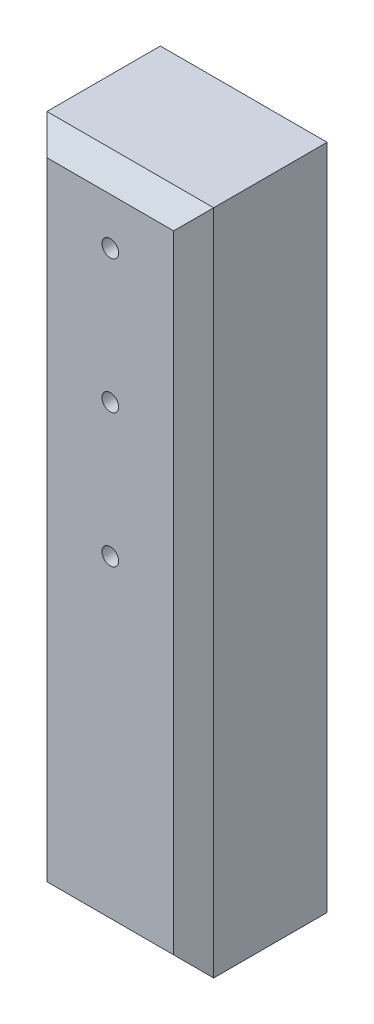
ISO-10303-21;
HEADER;
FILE_DESCRIPTION(('STEP AP214'),'2;1');
FILE_NAME('part.step','',(''),(''),'','','');
FILE_SCHEMA(('AUTOMOTIVE_DESIGN { 1 0 10303 214 1 1 1 1 }'));
ENDSEC;
DATA;
#1=APPLICATION_CONTEXT('core data for automotive mechanical design processes');
#2=APPLICATION_PROTOCOL_DEFINITION('international standard','automotive_design',2000,#1);
#3=PRODUCT_CONTEXT('',#1,'mechanical');
#4=PRODUCT('Part','Part','',(#3));
#5=PRODUCT_RELATED_PRODUCT_CATEGORY('part','',(#4));
#6=PRODUCT_DEFINITION_FORMATION('','',#4);
#7=PRODUCT_DEFINITION_CONTEXT('part definition',#1,'design');
#8=PRODUCT_DEFINITION('design','',#6,#7);
#9=PRODUCT_DEFINITION_SHAPE('','',#8);
#10=(LENGTH_UNIT() NAMED_UNIT(*) SI_UNIT(.MILLI.,.METRE.));
#11=(NAMED_UNIT(*) PLANE_ANGLE_UNIT() SI_UNIT($,.RADIAN.));
#12=(NAMED_UNIT(*) SI_UNIT($,.STERADIAN.) SOLID_ANGLE_UNIT());
#13=UNCERTAINTY_MEASURE_WITH_UNIT(LENGTH_MEASURE(1.E-05),#10,'distance_accuracy_value','');
#14=(GEOMETRIC_REPRESENTATION_CONTEXT(3) GLOBAL_UNCERTAINTY_ASSIGNED_CONTEXT((#13)) GLOBAL_UNIT_ASSIGNED_CONTEXT((#10,
#11,#12)) REPRESENTATION_CONTEXT('',''));
#15=CARTESIAN_POINT('',(0.,0.,0.));
#16=DIRECTION('',(0.,0.,1.));
#17=DIRECTION('',(1.,0.,0.));
#18=AXIS2_PLACEMENT_3D('',#15,#16,#17);
#19=CARTESIAN_POINT('',(-5.,100.,-5.00000000000002));
#20=DIRECTION('',(0.,-1.,0.));
#21=DIRECTION('',(0.,0.,-1.));
#22=AXIS2_PLACEMENT_3D('',#19,#20,#21);
#23=CYLINDRICAL_SURFACE('',#22,1.60000000000001);
#24=CARTESIAN_POINT('',(-5.,0.,-5.00000000000002));
#25=DIRECTION('',(0.,1.,0.));
#26=DIRECTION('',(0.,0.,1.));
#27=AXIS2_PLACEMENT_3D('',#24,#25,#26);
#28=CIRCLE('',#27,1.60000000000001);
#29=CARTESIAN_POINT('',(-5.,0.,-3.40000000000001));
#30=VERTEX_POINT('',#29);
#31=EDGE_CURVE('E104',#30,#30,#28,.T.);
#32=ORIENTED_EDGE('',*,*,#31,.F.);
#33=EDGE_LOOP('',(#32));
#34=FACE_BOUND('',#33,.T.);
#35=CARTESIAN_POINT('',(-5.,40.,-5.00000000000002));
#36=DIRECTION('',(0.,1.,0.));
#37=DIRECTION('',(0.,0.,1.));
#38=AXIS2_PLACEMENT_3D('',#35,#36,#37);
#39=CIRCLE('',#38,1.60000000000001);
#40=CARTESIAN_POINT('',(-5.,40.,-3.40000000000001));
#41=VERTEX_POINT('',#40);
#42=EDGE_CURVE('E168',#41,#41,#39,.T.);
#43=ORIENTED_EDGE('',*,*,#42,.T.);
#44=EDGE_LOOP('',(#43));
#45=FACE_BOUND('',#44,.T.);
#46=ADVANCED_FACE('F32',(#34,#45),#23,.F.);
#47=CARTESIAN_POINT('',(13.,100.,-5.00000000000002));
#48=DIRECTION('',(0.,-1.,0.));
#49=DIRECTION('',(0.,0.,-1.));
#50=AXIS2_PLACEMENT_3D('',#47,#48,#49);
#51=CYLINDRICAL_SURFACE('',#50,1.60000000000002);
#52=CARTESIAN_POINT('',(13.,0.,-5.00000000000002));
#53=DIRECTION('',(0.,1.,0.));
#54=DIRECTION('',(0.,0.,1.));
#55=AXIS2_PLACEMENT_3D('',#52,#53,#54);
#56=CIRCLE('',#55,1.60000000000002);
#57=CARTESIAN_POINT('',(13.,0.,-3.4));
#58=VERTEX_POINT('',#57);
#59=EDGE_CURVE('E109',#58,#58,#56,.T.);
#60=ORIENTED_EDGE('',*,*,#59,.F.);
#61=EDGE_LOOP('',(#60));
#62=FACE_BOUND('',#61,.T.);
#63=CARTESIAN_POINT('',(13.,40.,-5.00000000000002));
#64=DIRECTION('',(0.,1.,0.));
#65=DIRECTION('',(0.,0.,1.));
#66=AXIS2_PLACEMENT_3D('',#63,#64,#65);
#67=CIRCLE('',#66,1.60000000000002);
#68=CARTESIAN_POINT('',(13.,40.,-3.4));
#69=VERTEX_POINT('',#68);
#70=EDGE_CURVE('E165',#69,#69,#67,.T.);
#71=ORIENTED_EDGE('',*,*,#70,.T.);
#72=EDGE_LOOP('',(#71));
#73=FACE_BOUND('',#72,.T.);
#74=ADVANCED_FACE('F187',(#62,#73),#51,.F.);
#75=CARTESIAN_POINT('',(-5.,100.,4.99999999999999));
#76=DIRECTION('',(0.,-1.,0.));
#77=DIRECTION('',(0.,0.,-1.));
#78=AXIS2_PLACEMENT_3D('',#75,#76,#77);
#79=CYLINDRICAL_SURFACE('',#78,1.6);
#80=CARTESIAN_POINT('',(-5.,0.,4.99999999999999));
#81=DIRECTION('',(0.,1.,0.));
#82=DIRECTION('',(0.,0.,1.));
#83=AXIS2_PLACEMENT_3D('',#80,#81,#82);
#84=CIRCLE('',#83,1.6);
#85=CARTESIAN_POINT('',(-5.,0.,6.59999999999999));
#86=VERTEX_POINT('',#85);
#87=EDGE_CURVE('E179',#86,#86,#84,.T.);
#88=ORIENTED_EDGE('',*,*,#87,.F.);
#89=EDGE_LOOP('',(#88));
#90=FACE_BOUND('',#89,.T.);
#91=CARTESIAN_POINT('',(-5.,40.,4.99999999999999));
#92=DIRECTION('',(0.,1.,0.));
#93=DIRECTION('',(0.,0.,1.));
#94=AXIS2_PLACEMENT_3D('',#91,#92,#93);
#95=CIRCLE('',#94,1.6);
#96=CARTESIAN_POINT('',(-5.,40.,6.59999999999999));
#97=VERTEX_POINT('',#96);
#98=EDGE_CURVE('E162',#97,#97,#95,.T.);
#99=ORIENTED_EDGE('',*,*,#98,.T.);
#100=EDGE_LOOP('',(#99));
#101=FACE_BOUND('',#100,.T.);
#102=ADVANCED_FACE('F190',(#90,#101),#79,.F.);
#103=CARTESIAN_POINT('',(13.,100.,4.99999999999999));
#104=DIRECTION('',(0.,-1.,0.));
#105=DIRECTION('',(0.,0.,-1.));
#106=AXIS2_PLACEMENT_3D('',#103,#104,#105);
#107=CYLINDRICAL_SURFACE('',#106,1.6);
#108=CARTESIAN_POINT('',(13.,0.,4.99999999999999));
#109=DIRECTION('',(0.,1.,0.));
#110=DIRECTION('',(0.,0.,1.));
#111=AXIS2_PLACEMENT_3D('',#108,#109,#110);
#112=CIRCLE('',#111,1.6);
#113=CARTESIAN_POINT('',(13.,0.,6.59999999999999));
#114=VERTEX_POINT('',#113);
#115=EDGE_CURVE('E92',#114,#114,#112,.T.);
#116=ORIENTED_EDGE('',*,*,#115,.F.);
#117=EDGE_LOOP('',(#116));
#118=FACE_BOUND('',#117,.T.);
#119=CARTESIAN_POINT('',(13.,40.,4.99999999999999));
#120=DIRECTION('',(0.,1.,0.));
#121=DIRECTION('',(0.,0.,1.));
#122=AXIS2_PLACEMENT_3D('',#119,#120,#121);
#123=CIRCLE('',#122,1.6);
#124=CARTESIAN_POINT('',(13.,40.,6.59999999999999));
#125=VERTEX_POINT('',#124);
#126=EDGE_CURVE('E122',#125,#125,#123,.T.);
#127=ORIENTED_EDGE('',*,*,#126,.T.);
#128=EDGE_LOOP('',(#127));
#129=FACE_BOUND('',#128,.T.);
#130=ADVANCED_FACE('F221',(#118,#129),#107,.F.);
#131=CARTESIAN_POINT('',(0.,100.,0.));
#132=DIRECTION('',(0.,-1.,0.));
#133=DIRECTION('',(0.,0.,-1.));
#134=AXIS2_PLACEMENT_3D('',#131,#132,#133);
#135=PLANE('',#134);
#136=DIRECTION('',(0.,0.,1.));
#137=VECTOR('',#136,1.);
#138=CARTESIAN_POINT('',(-8.5,100.,9.99999999999998));
#139=LINE('',#138,#137);
#140=CARTESIAN_POINT('',(-8.5,100.,-10.));
#141=VERTEX_POINT('',#140);
#142=CARTESIAN_POINT('',(-8.5,100.,6.99999999999995));
#143=VERTEX_POINT('',#142);
#144=EDGE_CURVE('E87',#141,#143,#139,.T.);
#145=ORIENTED_EDGE('',*,*,#144,.T.);
#146=DIRECTION('',(1.,0.,0.));
#147=VECTOR('',#146,1.);
#148=CARTESIAN_POINT('',(0.,100.,6.99999999999996));
#149=LINE('',#148,#147);
#150=CARTESIAN_POINT('',(16.5,100.,6.99999999999999));
#151=VERTEX_POINT('',#150);
#152=EDGE_CURVE('E134',#143,#151,#149,.T.);
#153=ORIENTED_EDGE('',*,*,#152,.T.);
#154=DIRECTION('',(0.,0.,-1.));
#155=VECTOR('',#154,1.);
#156=CARTESIAN_POINT('',(16.5,100.,9.99999999999998));
#157=LINE('',#156,#155);
#158=CARTESIAN_POINT('',(16.5,100.,-10.));
#159=VERTEX_POINT('',#158);
#160=EDGE_CURVE('E173',#151,#159,#157,.T.);
#161=ORIENTED_EDGE('',*,*,#160,.T.);
#162=DIRECTION('',(-1.,0.,0.));
#163=VECTOR('',#162,1.);
#164=CARTESIAN_POINT('',(-17.25,100.,-10.));
#165=LINE('',#164,#163);
#166=EDGE_CURVE('E103',#159,#141,#165,.T.);
#167=ORIENTED_EDGE('',*,*,#166,.T.);
#168=EDGE_LOOP('',(#145,#153,#161,#167));
#169=FACE_BOUND('',#168,.T.);
#170=ADVANCED_FACE('F218',(#169),#135,.F.);
#171=CARTESIAN_POINT('',(0.,0.,0.));
#172=DIRECTION('',(0.,-1.,0.));
#173=DIRECTION('',(0.,0.,-1.));
#174=AXIS2_PLACEMENT_3D('',#171,#172,#173);
#175=PLANE('',#174);
#176=DIRECTION('',(0.,0.,-1.));
#177=VECTOR('',#176,1.);
#178=CARTESIAN_POINT('',(16.5,0.,9.99999999999998));
#179=LINE('',#178,#177);
#180=CARTESIAN_POINT('',(16.5,0.,6.99999999999999));
#181=VERTEX_POINT('',#180);
#182=CARTESIAN_POINT('',(16.5,0.,-10.));
#183=VERTEX_POINT('',#182);
#184=EDGE_CURVE('E171',#181,#183,#179,.T.);
#185=ORIENTED_EDGE('',*,*,#184,.F.);
#186=DIRECTION('',(-1.,0.,0.));
#187=VECTOR('',#186,1.);
#188=CARTESIAN_POINT('',(-8.49999999999999,0.,6.99999999999995));
#189=LINE('',#188,#187);
#190=CARTESIAN_POINT('',(-8.5,0.,6.99999999999995));
#191=VERTEX_POINT('',#190);
#192=EDGE_CURVE('E11',#181,#191,#189,.T.);
#193=ORIENTED_EDGE('',*,*,#192,.T.);
#194=DIRECTION('',(0.,0.,1.));
#195=VECTOR('',#194,1.);
#196=CARTESIAN_POINT('',(-8.5,0.,9.99999999999998));
#197=LINE('',#196,#195);
#198=CARTESIAN_POINT('',(-8.5,0.,-10.));
#199=VERTEX_POINT('',#198);
#200=EDGE_CURVE('E86',#199,#191,#197,.T.);
#201=ORIENTED_EDGE('',*,*,#200,.F.);
#202=DIRECTION('',(-1.,0.,0.));
#203=VECTOR('',#202,1.);
#204=CARTESIAN_POINT('',(17.25,0.,-10.));
#205=LINE('',#204,#203);
#206=EDGE_CURVE('E97',#183,#199,#205,.T.);
#207=ORIENTED_EDGE('',*,*,#206,.F.);
#208=EDGE_LOOP('',(#185,#193,#201,#207));
#209=FACE_BOUND('',#208,.T.);
#210=ORIENTED_EDGE('',*,*,#87,.T.);
#211=EDGE_LOOP('',(#210));
#212=FACE_BOUND('',#211,.T.);
#213=ORIENTED_EDGE('',*,*,#31,.T.);
#214=EDGE_LOOP('',(#213));
#215=FACE_BOUND('',#214,.T.);
#216=ORIENTED_EDGE('',*,*,#59,.T.);
#217=EDGE_LOOP('',(#216));
#218=FACE_BOUND('',#217,.T.);
#219=ORIENTED_EDGE('',*,*,#115,.T.);
#220=EDGE_LOOP('',(#219));
#221=FACE_BOUND('',#220,.T.);
#222=ADVANCED_FACE('F95',(#209,#212,#215,#218,#221),#175,.T.);
#223=CARTESIAN_POINT('',(17.25,100.,9.99999999999999));
#224=DIRECTION('',(0.,0.,-1.));
#225=DIRECTION('',(-1.,0.,0.));
#226=AXIS2_PLACEMENT_3D('',#223,#224,#225);
#227=PLANE('',#226);
#228=DIRECTION('',(1.,0.,0.));
#229=VECTOR('',#228,1.);
#230=CARTESIAN_POINT('',(16.5,2.99999999999999,9.99999999999999));
#231=LINE('',#230,#229);
#232=CARTESIAN_POINT('',(-5.50000000000002,2.99999999999999,9.99999999999996));
#233=VERTEX_POINT('',#232);
#234=CARTESIAN_POINT('',(13.5,2.99999999999999,9.99999999999999));
#235=VERTEX_POINT('',#234);
#236=EDGE_CURVE('E125',#233,#235,#231,.T.);
#237=ORIENTED_EDGE('',*,*,#236,.T.);
#238=DIRECTION('',(0.,1.,0.));
#239=VECTOR('',#238,1.);
#240=CARTESIAN_POINT('',(13.5,100.,9.99999999999999));
#241=LINE('',#240,#239);
#242=CARTESIAN_POINT('',(13.5,97.,9.99999999999999));
#243=VERTEX_POINT('',#242);
#244=EDGE_CURVE('E131',#235,#243,#241,.T.);
#245=ORIENTED_EDGE('',*,*,#244,.T.);
#246=DIRECTION('',(-1.,0.,0.));
#247=VECTOR('',#246,1.);
#248=CARTESIAN_POINT('',(17.25,97.,9.99999999999999));
#249=LINE('',#248,#247);
#250=CARTESIAN_POINT('',(-5.50000000000002,97.,9.99999999999996));
#251=VERTEX_POINT('',#250);
#252=EDGE_CURVE('E129',#243,#251,#249,.T.);
#253=ORIENTED_EDGE('',*,*,#252,.T.);
#254=DIRECTION('',(0.,-1.,0.));
#255=VECTOR('',#254,1.);
#256=CARTESIAN_POINT('',(-5.50000000000002,100.,9.99999999999996));
#257=LINE('',#256,#255);
#258=EDGE_CURVE('E127',#251,#233,#257,.T.);
#259=ORIENTED_EDGE('',*,*,#258,.T.);
#260=EDGE_LOOP('',(#237,#245,#253,#259));
#261=FACE_BOUND('',#260,.T.);
#262=CARTESIAN_POINT('',(4.,50.,9.99999999999997));
#263=DIRECTION('',(0.,0.,1.));
#264=DIRECTION('',(1.,0.,0.));
#265=AXIS2_PLACEMENT_3D('',#262,#263,#264);
#266=CIRCLE('',#265,1.25);
#267=CARTESIAN_POINT('',(5.25,50.,9.99999999999997));
#268=VERTEX_POINT('',#267);
#269=EDGE_CURVE('E116',#268,#268,#266,.T.);
#270=ORIENTED_EDGE('',*,*,#269,.F.);
#271=EDGE_LOOP('',(#270));
#272=FACE_BOUND('',#271,.T.);
#273=CARTESIAN_POINT('',(4.,70.,9.99999999999997));
#274=DIRECTION('',(0.,0.,1.));
#275=DIRECTION('',(1.,0.,0.));
#276=AXIS2_PLACEMENT_3D('',#273,#274,#275);
#277=CIRCLE('',#276,1.25);
#278=CARTESIAN_POINT('',(5.25,70.,9.99999999999997));
#279=VERTEX_POINT('',#278);
#280=EDGE_CURVE('E152',#279,#279,#277,.T.);
#281=ORIENTED_EDGE('',*,*,#280,.F.);
#282=EDGE_LOOP('',(#281));
#283=FACE_BOUND('',#282,.T.);
#284=CARTESIAN_POINT('',(4.,90.,9.99999999999997));
#285=DIRECTION('',(0.,0.,1.));
#286=DIRECTION('',(1.,0.,0.));
#287=AXIS2_PLACEMENT_3D('',#284,#285,#286);
#288=CIRCLE('',#287,1.25);
#289=CARTESIAN_POINT('',(5.25,90.,9.99999999999997));
#290=VERTEX_POINT('',#289);
#291=EDGE_CURVE('E146',#290,#290,#288,.T.);
#292=ORIENTED_EDGE('',*,*,#291,.F.);
#293=EDGE_LOOP('',(#292));
#294=FACE_BOUND('',#293,.T.);
#295=ADVANCED_FACE('F225',(#261,#272,#283,#294),#227,.F.);
#296=CARTESIAN_POINT('',(17.25,100.,-10.));
#297=DIRECTION('',(0.,0.,1.));
#298=DIRECTION('',(1.,0.,0.));
#299=AXIS2_PLACEMENT_3D('',#296,#297,#298);
#300=PLANE('',#299);
#301=CARTESIAN_POINT('',(4.,50.,-10.));
#302=DIRECTION('',(0.,0.,1.));
#303=DIRECTION('',(1.,0.,0.));
#304=AXIS2_PLACEMENT_3D('',#301,#302,#303);
#305=CIRCLE('',#304,1.25);
#306=CARTESIAN_POINT('',(5.25,50.,-10.));
#307=VERTEX_POINT('',#306);
#308=EDGE_CURVE('E119',#307,#307,#305,.T.);
#309=ORIENTED_EDGE('',*,*,#308,.T.);
#310=EDGE_LOOP('',(#309));
#311=FACE_BOUND('',#310,.T.);
#312=CARTESIAN_POINT('',(4.,70.,-10.));
#313=DIRECTION('',(0.,0.,1.));
#314=DIRECTION('',(1.,0.,0.));
#315=AXIS2_PLACEMENT_3D('',#312,#313,#314);
#316=CIRCLE('',#315,1.25);
#317=CARTESIAN_POINT('',(5.25,70.,-10.));
#318=VERTEX_POINT('',#317);
#319=EDGE_CURVE('E115',#318,#318,#316,.T.);
#320=ORIENTED_EDGE('',*,*,#319,.T.);
#321=EDGE_LOOP('',(#320));
#322=FACE_BOUND('',#321,.T.);
#323=CARTESIAN_POINT('',(4.,90.,-10.));
#324=DIRECTION('',(0.,0.,1.));
#325=DIRECTION('',(1.,0.,0.));
#326=AXIS2_PLACEMENT_3D('',#323,#324,#325);
#327=CIRCLE('',#326,1.25);
#328=CARTESIAN_POINT('',(5.25,90.,-10.));
#329=VERTEX_POINT('',#328);
#330=EDGE_CURVE('E112',#329,#329,#327,.T.);
#331=ORIENTED_EDGE('',*,*,#330,.T.);
#332=EDGE_LOOP('',(#331));
#333=FACE_BOUND('',#332,.T.);
#334=DIRECTION('',(0.,-1.,0.));
#335=VECTOR('',#334,1.);
#336=CARTESIAN_POINT('',(16.5,100.,-10.));
#337=LINE('',#336,#335);
#338=EDGE_CURVE('E98',#159,#183,#337,.T.);
#339=ORIENTED_EDGE('',*,*,#338,.T.);
#340=ORIENTED_EDGE('',*,*,#206,.T.);
#341=DIRECTION('',(0.,-1.,0.));
#342=VECTOR('',#341,1.);
#343=CARTESIAN_POINT('',(-8.5,100.,-10.));
#344=LINE('',#343,#342);
#345=EDGE_CURVE('E84',#141,#199,#344,.T.);
#346=ORIENTED_EDGE('',*,*,#345,.F.);
#347=ORIENTED_EDGE('',*,*,#166,.F.);
#348=EDGE_LOOP('',(#339,#340,#346,#347));
#349=FACE_BOUND('',#348,.T.);
#350=ADVANCED_FACE('F101',(#311,#322,#333,#349),#300,.F.);
#351=CARTESIAN_POINT('',(16.5,100.,9.99999999999998));
#352=DIRECTION('',(-1.,0.,0.));
#353=DIRECTION('',(0.,0.,1.));
#354=AXIS2_PLACEMENT_3D('',#351,#352,#353);
#355=PLANE('',#354);
#356=ORIENTED_EDGE('',*,*,#160,.F.);
#357=DIRECTION('',(0.,-1.,0.));
#358=VECTOR('',#357,1.);
#359=CARTESIAN_POINT('',(16.5,100.,6.99999999999999));
#360=LINE('',#359,#358);
#361=EDGE_CURVE('E106',#151,#181,#360,.T.);
#362=ORIENTED_EDGE('',*,*,#361,.T.);
#363=ORIENTED_EDGE('',*,*,#184,.T.);
#364=ORIENTED_EDGE('',*,*,#338,.F.);
#365=EDGE_LOOP('',(#356,#362,#363,#364));
#366=FACE_BOUND('',#365,.T.);
#367=ADVANCED_FACE('F228',(#366),#355,.F.);
#368=CARTESIAN_POINT('',(-8.5,100.,9.99999999999998));
#369=DIRECTION('',(1.,0.,0.));
#370=DIRECTION('',(0.,0.,-1.));
#371=AXIS2_PLACEMENT_3D('',#368,#369,#370);
#372=PLANE('',#371);
#373=ORIENTED_EDGE('',*,*,#200,.T.);
#374=DIRECTION('',(0.,1.,0.));
#375=VECTOR('',#374,1.);
#376=CARTESIAN_POINT('',(-8.5,100.,6.99999999999995));
#377=LINE('',#376,#375);
#378=EDGE_CURVE('E41',#191,#143,#377,.T.);
#379=ORIENTED_EDGE('',*,*,#378,.T.);
#380=ORIENTED_EDGE('',*,*,#144,.F.);
#381=ORIENTED_EDGE('',*,*,#345,.T.);
#382=EDGE_LOOP('',(#373,#379,#380,#381));
#383=FACE_BOUND('',#382,.T.);
#384=ADVANCED_FACE('F85',(#383),#372,.F.);
#385=CARTESIAN_POINT('',(0.,40.,0.));
#386=DIRECTION('',(0.,1.,0.));
#387=DIRECTION('',(0.,0.,1.));
#388=AXIS2_PLACEMENT_3D('',#385,#386,#387);
#389=PLANE('',#388);
#390=ORIENTED_EDGE('',*,*,#126,.F.);
#391=EDGE_LOOP('',(#390));
#392=FACE_BOUND('',#391,.T.);
#393=ADVANCED_FACE('F205',(#392),#389,.F.);
#394=ORIENTED_EDGE('',*,*,#98,.F.);
#395=EDGE_LOOP('',(#394));
#396=FACE_BOUND('',#395,.T.);
#397=ADVANCED_FACE('F197',(#396),#389,.F.);
#398=ORIENTED_EDGE('',*,*,#70,.F.);
#399=EDGE_LOOP('',(#398));
#400=FACE_BOUND('',#399,.T.);
#401=ADVANCED_FACE('F194',(#400),#389,.F.);
#402=ORIENTED_EDGE('',*,*,#42,.F.);
#403=EDGE_LOOP('',(#402));
#404=FACE_BOUND('',#403,.T.);
#405=ADVANCED_FACE('F196',(#404),#389,.F.);
#406=CARTESIAN_POINT('',(4.,90.,-50.));
#407=DIRECTION('',(0.,0.,1.));
#408=DIRECTION('',(1.,0.,0.));
#409=AXIS2_PLACEMENT_3D('',#406,#407,#408);
#410=CYLINDRICAL_SURFACE('',#409,1.25);
#411=ORIENTED_EDGE('',*,*,#291,.T.);
#412=EDGE_LOOP('',(#411));
#413=FACE_BOUND('',#412,.T.);
#414=ORIENTED_EDGE('',*,*,#330,.F.);
#415=EDGE_LOOP('',(#414));
#416=FACE_BOUND('',#415,.T.);
#417=ADVANCED_FACE('F203',(#413,#416),#410,.F.);
#418=CARTESIAN_POINT('',(4.,70.,-50.));
#419=DIRECTION('',(0.,0.,1.));
#420=DIRECTION('',(1.,0.,0.));
#421=AXIS2_PLACEMENT_3D('',#418,#419,#420);
#422=CYLINDRICAL_SURFACE('',#421,1.25);
#423=ORIENTED_EDGE('',*,*,#280,.T.);
#424=EDGE_LOOP('',(#423));
#425=FACE_BOUND('',#424,.T.);
#426=ORIENTED_EDGE('',*,*,#319,.F.);
#427=EDGE_LOOP('',(#426));
#428=FACE_BOUND('',#427,.T.);
#429=ADVANCED_FACE('F249',(#425,#428),#422,.F.);
#430=CARTESIAN_POINT('',(4.,50.,-50.));
#431=DIRECTION('',(0.,0.,1.));
#432=DIRECTION('',(1.,0.,0.));
#433=AXIS2_PLACEMENT_3D('',#430,#431,#432);
#434=CYLINDRICAL_SURFACE('',#433,1.25);
#435=ORIENTED_EDGE('',*,*,#269,.T.);
#436=EDGE_LOOP('',(#435));
#437=FACE_BOUND('',#436,.T.);
#438=ORIENTED_EDGE('',*,*,#308,.F.);
#439=EDGE_LOOP('',(#438));
#440=FACE_BOUND('',#439,.T.);
#441=ADVANCED_FACE('F244',(#437,#440),#434,.F.);
#442=CARTESIAN_POINT('',(-5.50000000000002,100.,9.99999999999996));
#443=DIRECTION('',(0.70710678118655,0.,-0.707106781186545));
#444=DIRECTION('',(0.,-1.,0.));
#445=AXIS2_PLACEMENT_3D('',#442,#443,#444);
#446=PLANE('',#445);
#447=DIRECTION('',(0.577350269189625,0.577350269189625,0.577350269189628));
#448=VECTOR('',#447,1.);
#449=CARTESIAN_POINT('',(2.0833333333333,10.5833333333333,17.5833333333333));
#450=LINE('',#449,#448);
#451=EDGE_CURVE('E140',#233,#191,#450,.F.);
#452=ORIENTED_EDGE('',*,*,#451,.F.);
#453=ORIENTED_EDGE('',*,*,#258,.F.);
#454=DIRECTION('',(-0.577350269189625,0.577350269189625,-0.577350269189628));
#455=VECTOR('',#454,1.);
#456=CARTESIAN_POINT('',(-6.50000000000001,98.,8.99999999999996));
#457=LINE('',#456,#455);
#458=EDGE_CURVE('E36',#143,#251,#457,.F.);
#459=ORIENTED_EDGE('',*,*,#458,.F.);
#460=ORIENTED_EDGE('',*,*,#378,.F.);
#461=EDGE_LOOP('',(#452,#453,#459,#460));
#462=FACE_BOUND('',#461,.T.);
#463=ADVANCED_FACE('F34',(#462),#446,.F.);
#464=CARTESIAN_POINT('',(0.,100.,6.99999999999996));
#465=DIRECTION('',(0.,-0.707106781186549,-0.707106781186546));
#466=DIRECTION('',(1.,0.,0.));
#467=AXIS2_PLACEMENT_3D('',#464,#465,#466);
#468=PLANE('',#467);
#469=ORIENTED_EDGE('',*,*,#458,.T.);
#470=ORIENTED_EDGE('',*,*,#252,.F.);
#471=DIRECTION('',(0.577350269189625,0.577350269189625,-0.577350269189627));
#472=VECTOR('',#471,1.);
#473=CARTESIAN_POINT('',(11.,94.5,12.5));
#474=LINE('',#473,#472);
#475=EDGE_CURVE('E139',#151,#243,#474,.F.);
#476=ORIENTED_EDGE('',*,*,#475,.F.);
#477=ORIENTED_EDGE('',*,*,#152,.F.);
#478=EDGE_LOOP('',(#469,#470,#476,#477));
#479=FACE_BOUND('',#478,.T.);
#480=ADVANCED_FACE('F239',(#479),#468,.F.);
#481=CARTESIAN_POINT('',(17.25,2.99999999999999,9.99999999999999));
#482=DIRECTION('',(0.,-0.707106781186549,0.707106781186546));
#483=DIRECTION('',(-1.,0.,0.));
#484=AXIS2_PLACEMENT_3D('',#481,#482,#483);
#485=PLANE('',#484);
#486=ORIENTED_EDGE('',*,*,#451,.T.);
#487=ORIENTED_EDGE('',*,*,#192,.F.);
#488=DIRECTION('',(0.577350269189625,-0.577350269189625,-0.577350269189627));
#489=VECTOR('',#488,1.);
#490=CARTESIAN_POINT('',(14.75,1.75,8.74999999999999));
#491=LINE('',#490,#489);
#492=EDGE_CURVE('E137',#235,#181,#491,.T.);
#493=ORIENTED_EDGE('',*,*,#492,.F.);
#494=ORIENTED_EDGE('',*,*,#236,.F.);
#495=EDGE_LOOP('',(#486,#487,#493,#494));
#496=FACE_BOUND('',#495,.T.);
#497=ADVANCED_FACE('F236',(#496),#485,.T.);
#498=CARTESIAN_POINT('',(16.5,100.,6.99999999999999));
#499=DIRECTION('',(-0.707106781186549,0.,-0.707106781186546));
#500=DIRECTION('',(0.,-1.,0.));
#501=AXIS2_PLACEMENT_3D('',#498,#499,#500);
#502=PLANE('',#501);
#503=ORIENTED_EDGE('',*,*,#475,.T.);
#504=ORIENTED_EDGE('',*,*,#244,.F.);
#505=ORIENTED_EDGE('',*,*,#492,.T.);
#506=ORIENTED_EDGE('',*,*,#361,.F.);
#507=EDGE_LOOP('',(#503,#504,#505,#506));
#508=FACE_BOUND('',#507,.T.);
#509=ADVANCED_FACE('F233',(#508),#502,.F.);
#510=CLOSED_SHELL('',(#46,#74,#102,#130,#170,#222,#295,#350,#367,#384,#393,#397,#401,#405,#417,
#429,#441,#463,#480,#497,#509));
#511=MANIFOLD_SOLID_BREP('B2',#510);
#512=ADVANCED_BREP_SHAPE_REPRESENTATION('',(#18,#511),#14);
#513=SHAPE_DEFINITION_REPRESENTATION(#9,#512);
ENDSEC;
END-ISO-10303-21;
